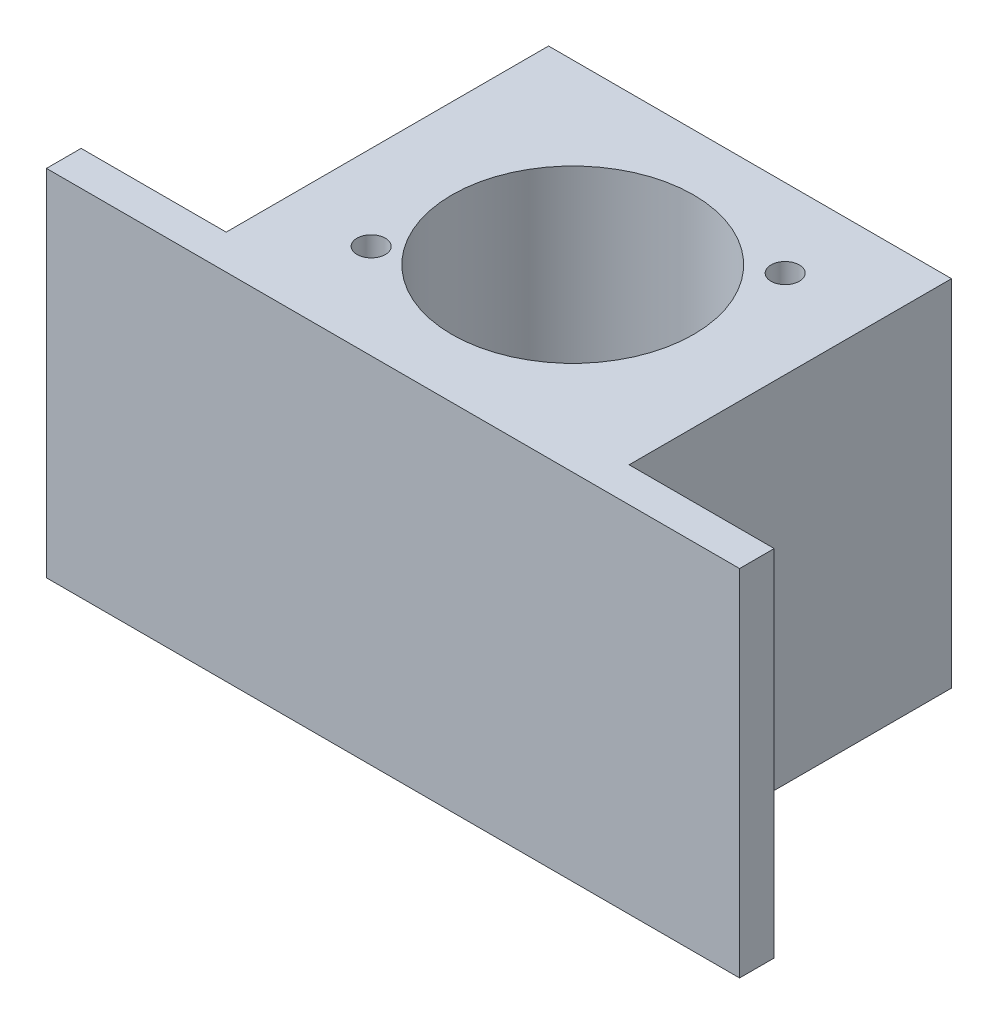
ISO-10303-21;
HEADER;
FILE_DESCRIPTION(('STEP AP214'),'2;1');
FILE_NAME('part.step','',(''),(''),'','','');
FILE_SCHEMA(('AUTOMOTIVE_DESIGN { 1 0 10303 214 1 1 1 1 }'));
ENDSEC;
DATA;
#1=APPLICATION_CONTEXT('core data for automotive mechanical design processes');
#2=APPLICATION_PROTOCOL_DEFINITION('international standard','automotive_design',2000,#1);
#3=PRODUCT_CONTEXT('',#1,'mechanical');
#4=PRODUCT('Part','Part','',(#3));
#5=PRODUCT_RELATED_PRODUCT_CATEGORY('part','',(#4));
#6=PRODUCT_DEFINITION_FORMATION('','',#4);
#7=PRODUCT_DEFINITION_CONTEXT('part definition',#1,'design');
#8=PRODUCT_DEFINITION('design','',#6,#7);
#9=PRODUCT_DEFINITION_SHAPE('','',#8);
#10=(LENGTH_UNIT() NAMED_UNIT(*) SI_UNIT(.MILLI.,.METRE.));
#11=(NAMED_UNIT(*) PLANE_ANGLE_UNIT() SI_UNIT($,.RADIAN.));
#12=(NAMED_UNIT(*) SI_UNIT($,.STERADIAN.) SOLID_ANGLE_UNIT());
#13=UNCERTAINTY_MEASURE_WITH_UNIT(LENGTH_MEASURE(1.E-05),#10,'distance_accuracy_value','');
#14=(GEOMETRIC_REPRESENTATION_CONTEXT(3) GLOBAL_UNCERTAINTY_ASSIGNED_CONTEXT((#13)) GLOBAL_UNIT_ASSIGNED_CONTEXT((#10,
#11,#12)) REPRESENTATION_CONTEXT('',''));
#15=CARTESIAN_POINT('',(0.,0.,0.));
#16=DIRECTION('',(0.,0.,1.));
#17=DIRECTION('',(1.,0.,0.));
#18=AXIS2_PLACEMENT_3D('',#15,#16,#17);
#19=CARTESIAN_POINT('',(0.,0.,-30.));
#20=DIRECTION('',(0.,0.,1.));
#21=DIRECTION('',(1.,0.,0.));
#22=AXIS2_PLACEMENT_3D('',#19,#20,#21);
#23=PLANE('',#22);
#24=DIRECTION('',(0.,-1.,0.));
#25=VECTOR('',#24,1.);
#26=CARTESIAN_POINT('',(-72.5,-25.,-30.));
#27=LINE('',#26,#25);
#28=CARTESIAN_POINT('',(-72.5,-25.,-30.));
#29=VERTEX_POINT('',#28);
#30=CARTESIAN_POINT('',(-72.4999999999999,-45.,-30.));
#31=VERTEX_POINT('',#30);
#32=EDGE_CURVE('E394',#29,#31,#27,.T.);
#33=ORIENTED_EDGE('',*,*,#32,.F.);
#34=CARTESIAN_POINT('',(-77.5,-25.,-30.));
#35=DIRECTION('',(0.,0.,-1.));
#36=DIRECTION('',(-1.,0.,0.));
#37=AXIS2_PLACEMENT_3D('',#34,#35,#36);
#38=CIRCLE('',#37,5.00000000000002);
#39=CARTESIAN_POINT('',(-82.5,-25.,-30.));
#40=VERTEX_POINT('',#39);
#41=EDGE_CURVE('E74',#40,#29,#38,.T.);
#42=ORIENTED_EDGE('',*,*,#41,.F.);
#43=DIRECTION('',(0.,1.,0.));
#44=VECTOR('',#43,1.);
#45=CARTESIAN_POINT('',(-82.5,-25.,-30.));
#46=LINE('',#45,#44);
#47=CARTESIAN_POINT('',(-82.5,-45.,-30.));
#48=VERTEX_POINT('',#47);
#49=EDGE_CURVE('E385',#48,#40,#46,.T.);
#50=ORIENTED_EDGE('',*,*,#49,.F.);
#51=CARTESIAN_POINT('',(-77.5,-45.,-30.));
#52=DIRECTION('',(0.,0.,-1.));
#53=DIRECTION('',(-1.,0.,0.));
#54=AXIS2_PLACEMENT_3D('',#51,#52,#53);
#55=CIRCLE('',#54,5.00000000000002);
#56=EDGE_CURVE('E390',#31,#48,#55,.T.);
#57=ORIENTED_EDGE('',*,*,#56,.F.);
#58=EDGE_LOOP('',(#33,#42,#50,#57));
#59=FACE_BOUND('',#58,.T.);
#60=DIRECTION('',(0.,-1.,0.));
#61=VECTOR('',#60,1.);
#62=CARTESIAN_POINT('',(-72.5,45.,-30.));
#63=LINE('',#62,#61);
#64=CARTESIAN_POINT('',(-72.5,45.,-30.));
#65=VERTEX_POINT('',#64);
#66=CARTESIAN_POINT('',(-72.5,25.,-30.));
#67=VERTEX_POINT('',#66);
#68=EDGE_CURVE('E349',#65,#67,#63,.T.);
#69=ORIENTED_EDGE('',*,*,#68,.F.);
#70=CARTESIAN_POINT('',(-77.5,45.,-30.));
#71=DIRECTION('',(0.,0.,-1.));
#72=DIRECTION('',(-1.,0.,0.));
#73=AXIS2_PLACEMENT_3D('',#70,#71,#72);
#74=CIRCLE('',#73,5.);
#75=CARTESIAN_POINT('',(-82.5,45.,-30.));
#76=VERTEX_POINT('',#75);
#77=EDGE_CURVE('E353',#76,#65,#74,.T.);
#78=ORIENTED_EDGE('',*,*,#77,.F.);
#79=DIRECTION('',(0.,1.,0.));
#80=VECTOR('',#79,1.);
#81=CARTESIAN_POINT('',(-82.5,45.,-30.));
#82=LINE('',#81,#80);
#83=CARTESIAN_POINT('',(-82.5,25.,-30.));
#84=VERTEX_POINT('',#83);
#85=EDGE_CURVE('E340',#84,#76,#82,.T.);
#86=ORIENTED_EDGE('',*,*,#85,.F.);
#87=CARTESIAN_POINT('',(-77.5,25.,-30.));
#88=DIRECTION('',(0.,0.,-1.));
#89=DIRECTION('',(-1.,0.,0.));
#90=AXIS2_PLACEMENT_3D('',#87,#88,#89);
#91=CIRCLE('',#90,5.);
#92=EDGE_CURVE('E345',#67,#84,#91,.T.);
#93=ORIENTED_EDGE('',*,*,#92,.F.);
#94=EDGE_LOOP('',(#69,#78,#86,#93));
#95=FACE_BOUND('',#94,.T.);
#96=DIRECTION('',(0.,1.,0.));
#97=VECTOR('',#96,1.);
#98=CARTESIAN_POINT('',(-62.5,55.,-30.));
#99=LINE('',#98,#97);
#100=CARTESIAN_POINT('',(-62.5,-55.,-30.));
#101=VERTEX_POINT('',#100);
#102=CARTESIAN_POINT('',(-62.5,55.,-30.));
#103=VERTEX_POINT('',#102);
#104=EDGE_CURVE('E287',#101,#103,#99,.T.);
#105=ORIENTED_EDGE('',*,*,#104,.F.);
#106=DIRECTION('',(1.,0.,0.));
#107=VECTOR('',#106,1.);
#108=CARTESIAN_POINT('',(-107.5,-55.,-30.));
#109=LINE('',#108,#107);
#110=CARTESIAN_POINT('',(-107.5,-55.,-30.));
#111=VERTEX_POINT('',#110);
#112=EDGE_CURVE('E249',#111,#101,#109,.T.);
#113=ORIENTED_EDGE('',*,*,#112,.F.);
#114=DIRECTION('',(0.,-1.,0.));
#115=VECTOR('',#114,1.);
#116=CARTESIAN_POINT('',(-107.5,55.,-30.));
#117=LINE('',#116,#115);
#118=CARTESIAN_POINT('',(-107.5,55.,-30.));
#119=VERTEX_POINT('',#118);
#120=EDGE_CURVE('E255',#119,#111,#117,.T.);
#121=ORIENTED_EDGE('',*,*,#120,.F.);
#122=DIRECTION('',(-1.,0.,0.));
#123=VECTOR('',#122,1.);
#124=CARTESIAN_POINT('',(-107.5,55.,-30.));
#125=LINE('',#124,#123);
#126=EDGE_CURVE('E244',#103,#119,#125,.T.);
#127=ORIENTED_EDGE('',*,*,#126,.F.);
#128=EDGE_LOOP('',(#105,#113,#121,#127));
#129=FACE_BOUND('',#128,.T.);
#130=ADVANCED_FACE('F48',(#59,#95,#129),#23,.F.);
#131=DIRECTION('',(0.,-1.,0.));
#132=VECTOR('',#131,1.);
#133=CARTESIAN_POINT('',(77.5,44.999999999999,-30.));
#134=LINE('',#133,#132);
#135=CARTESIAN_POINT('',(77.5,44.999999999999,-30.));
#136=VERTEX_POINT('',#135);
#137=CARTESIAN_POINT('',(77.5,24.999999999999,-30.));
#138=VERTEX_POINT('',#137);
#139=EDGE_CURVE('E437',#136,#138,#134,.T.);
#140=ORIENTED_EDGE('',*,*,#139,.F.);
#141=CARTESIAN_POINT('',(72.5,44.999999999999,-30.));
#142=DIRECTION('',(0.,0.,-1.));
#143=DIRECTION('',(-1.,0.,0.));
#144=AXIS2_PLACEMENT_3D('',#141,#142,#143);
#145=CIRCLE('',#144,4.99999999999996);
#146=CARTESIAN_POINT('',(67.5,44.999999999999,-30.));
#147=VERTEX_POINT('',#146);
#148=EDGE_CURVE('E384',#147,#136,#145,.T.);
#149=ORIENTED_EDGE('',*,*,#148,.F.);
#150=DIRECTION('',(0.,1.,0.));
#151=VECTOR('',#150,1.);
#152=CARTESIAN_POINT('',(67.5,44.999999999999,-30.));
#153=LINE('',#152,#151);
#154=CARTESIAN_POINT('',(67.5,24.999999999999,-30.));
#155=VERTEX_POINT('',#154);
#156=EDGE_CURVE('E428',#155,#147,#153,.T.);
#157=ORIENTED_EDGE('',*,*,#156,.F.);
#158=CARTESIAN_POINT('',(72.5,24.999999999999,-30.));
#159=DIRECTION('',(0.,0.,-1.));
#160=DIRECTION('',(-1.,0.,0.));
#161=AXIS2_PLACEMENT_3D('',#158,#159,#160);
#162=CIRCLE('',#161,4.99999999999998);
#163=EDGE_CURVE('E433',#138,#155,#162,.T.);
#164=ORIENTED_EDGE('',*,*,#163,.F.);
#165=EDGE_LOOP('',(#140,#149,#157,#164));
#166=FACE_BOUND('',#165,.T.);
#167=DIRECTION('',(0.,-1.,0.));
#168=VECTOR('',#167,1.);
#169=CARTESIAN_POINT('',(77.5,-25.,-30.));
#170=LINE('',#169,#168);
#171=CARTESIAN_POINT('',(77.5,-25.,-30.));
#172=VERTEX_POINT('',#171);
#173=CARTESIAN_POINT('',(77.5,-45.,-30.));
#174=VERTEX_POINT('',#173);
#175=EDGE_CURVE('E479',#172,#174,#170,.T.);
#176=ORIENTED_EDGE('',*,*,#175,.F.);
#177=CARTESIAN_POINT('',(72.5,-25.,-30.));
#178=DIRECTION('',(0.,0.,-1.));
#179=DIRECTION('',(-1.,0.,0.));
#180=AXIS2_PLACEMENT_3D('',#177,#178,#179);
#181=CIRCLE('',#180,4.99999999999996);
#182=CARTESIAN_POINT('',(67.5,-25.,-30.));
#183=VERTEX_POINT('',#182);
#184=EDGE_CURVE('E483',#183,#172,#181,.T.);
#185=ORIENTED_EDGE('',*,*,#184,.F.);
#186=DIRECTION('',(0.,1.,0.));
#187=VECTOR('',#186,1.);
#188=CARTESIAN_POINT('',(67.5,-25.,-30.));
#189=LINE('',#188,#187);
#190=CARTESIAN_POINT('',(67.5,-45.,-30.));
#191=VERTEX_POINT('',#190);
#192=EDGE_CURVE('E470',#191,#183,#189,.T.);
#193=ORIENTED_EDGE('',*,*,#192,.F.);
#194=CARTESIAN_POINT('',(72.5,-45.,-30.));
#195=DIRECTION('',(0.,0.,-1.));
#196=DIRECTION('',(-1.,0.,0.));
#197=AXIS2_PLACEMENT_3D('',#194,#195,#196);
#198=CIRCLE('',#197,4.99999999999996);
#199=EDGE_CURVE('E475',#174,#191,#198,.T.);
#200=ORIENTED_EDGE('',*,*,#199,.F.);
#201=EDGE_LOOP('',(#176,#185,#193,#200));
#202=FACE_BOUND('',#201,.T.);
#203=DIRECTION('',(0.,-1.,0.));
#204=VECTOR('',#203,1.);
#205=CARTESIAN_POINT('',(62.5,55.,-30.));
#206=LINE('',#205,#204);
#207=CARTESIAN_POINT('',(62.4999999999999,55.,-30.));
#208=VERTEX_POINT('',#207);
#209=CARTESIAN_POINT('',(62.5,-55.,-30.));
#210=VERTEX_POINT('',#209);
#211=EDGE_CURVE('E282',#208,#210,#206,.T.);
#212=ORIENTED_EDGE('',*,*,#211,.F.);
#213=CARTESIAN_POINT('',(107.5,55.,-30.));
#214=VERTEX_POINT('',#213);
#215=EDGE_CURVE('E258',#214,#208,#125,.T.);
#216=ORIENTED_EDGE('',*,*,#215,.F.);
#217=DIRECTION('',(0.,1.,0.));
#218=VECTOR('',#217,1.);
#219=CARTESIAN_POINT('',(107.5,55.,-30.));
#220=LINE('',#219,#218);
#221=CARTESIAN_POINT('',(107.5,-55.,-30.));
#222=VERTEX_POINT('',#221);
#223=EDGE_CURVE('E262',#222,#214,#220,.T.);
#224=ORIENTED_EDGE('',*,*,#223,.F.);
#225=EDGE_CURVE('E254',#210,#222,#109,.T.);
#226=ORIENTED_EDGE('',*,*,#225,.F.);
#227=EDGE_LOOP('',(#212,#216,#224,#226));
#228=FACE_BOUND('',#227,.T.);
#229=ADVANCED_FACE('F530',(#166,#202,#228),#23,.F.);
#230=CARTESIAN_POINT('',(107.5,55.,-30.));
#231=DIRECTION('',(1.,0.,0.));
#232=DIRECTION('',(0.,1.,0.));
#233=AXIS2_PLACEMENT_3D('',#230,#231,#232);
#234=PLANE('',#233);
#235=DIRECTION('',(0.,-1.,0.));
#236=VECTOR('',#235,1.);
#237=CARTESIAN_POINT('',(107.5,270.860053043633,-19.25));
#238=LINE('',#237,#236);
#239=CARTESIAN_POINT('',(107.5,55.,-19.25));
#240=VERTEX_POINT('',#239);
#241=CARTESIAN_POINT('',(107.5,-55.,-19.25));
#242=VERTEX_POINT('',#241);
#243=EDGE_CURVE('E66',#240,#242,#238,.T.);
#244=ORIENTED_EDGE('',*,*,#243,.T.);
#245=DIRECTION('',(0.,0.,1.));
#246=VECTOR('',#245,1.);
#247=CARTESIAN_POINT('',(107.5,-55.,-30.));
#248=LINE('',#247,#246);
#249=EDGE_CURVE('E11',#222,#242,#248,.T.);
#250=ORIENTED_EDGE('',*,*,#249,.F.);
#251=ORIENTED_EDGE('',*,*,#223,.T.);
#252=DIRECTION('',(0.,0.,1.));
#253=VECTOR('',#252,1.);
#254=CARTESIAN_POINT('',(107.5,55.,-30.));
#255=LINE('',#254,#253);
#256=EDGE_CURVE('E52',#214,#240,#255,.T.);
#257=ORIENTED_EDGE('',*,*,#256,.T.);
#258=EDGE_LOOP('',(#244,#250,#251,#257));
#259=FACE_BOUND('',#258,.T.);
#260=ADVANCED_FACE('F50',(#259),#234,.T.);
#261=CARTESIAN_POINT('',(-107.5,-55.,-30.));
#262=DIRECTION('',(0.,-1.,0.));
#263=DIRECTION('',(0.,0.,-1.));
#264=AXIS2_PLACEMENT_3D('',#261,#262,#263);
#265=PLANE('',#264);
#266=DIRECTION('',(1.,0.,0.));
#267=VECTOR('',#266,1.);
#268=CARTESIAN_POINT('',(-107.5,-55.,-19.25));
#269=LINE('',#268,#267);
#270=CARTESIAN_POINT('',(-107.5,-55.,-19.25));
#271=VERTEX_POINT('',#270);
#272=EDGE_CURVE('E239',#271,#242,#269,.T.);
#273=ORIENTED_EDGE('',*,*,#272,.F.);
#274=DIRECTION('',(0.,0.,1.));
#275=VECTOR('',#274,1.);
#276=CARTESIAN_POINT('',(-107.5,-55.,-30.));
#277=LINE('',#276,#275);
#278=EDGE_CURVE('E58',#111,#271,#277,.T.);
#279=ORIENTED_EDGE('',*,*,#278,.F.);
#280=ORIENTED_EDGE('',*,*,#112,.T.);
#281=DIRECTION('',(0.,0.,1.));
#282=VECTOR('',#281,1.);
#283=CARTESIAN_POINT('',(-62.5,-55.,-130.));
#284=LINE('',#283,#282);
#285=CARTESIAN_POINT('',(-62.5,-55.,-130.));
#286=VERTEX_POINT('',#285);
#287=EDGE_CURVE('E277',#286,#101,#284,.T.);
#288=ORIENTED_EDGE('',*,*,#287,.F.);
#289=DIRECTION('',(-1.,0.,0.));
#290=VECTOR('',#289,1.);
#291=CARTESIAN_POINT('',(62.5,-55.,-130.));
#292=LINE('',#291,#290);
#293=CARTESIAN_POINT('',(62.5,-55.,-130.));
#294=VERTEX_POINT('',#293);
#295=EDGE_CURVE('E281',#294,#286,#292,.T.);
#296=ORIENTED_EDGE('',*,*,#295,.F.);
#297=DIRECTION('',(0.,0.,1.));
#298=VECTOR('',#297,1.);
#299=CARTESIAN_POINT('',(62.5,-55.,-130.));
#300=LINE('',#299,#298);
#301=EDGE_CURVE('E273',#294,#210,#300,.T.);
#302=ORIENTED_EDGE('',*,*,#301,.T.);
#303=ORIENTED_EDGE('',*,*,#225,.T.);
#304=ORIENTED_EDGE('',*,*,#249,.T.);
#305=EDGE_LOOP('',(#273,#279,#280,#288,#296,#302,#303,#304));
#306=FACE_BOUND('',#305,.T.);
#307=CARTESIAN_POINT('',(34.6882295483987,-55.,-40.3746294951222));
#308=DIRECTION('',(0.,-1.,0.));
#309=DIRECTION('',(0.,0.,-1.));
#310=AXIS2_PLACEMENT_3D('',#307,#308,#309);
#311=CIRCLE('',#310,4.39999999999999);
#312=CARTESIAN_POINT('',(34.6882295483987,-55.,-44.7746294951222));
#313=VERTEX_POINT('',#312);
#314=EDGE_CURVE('E512',#313,#313,#311,.T.);
#315=ORIENTED_EDGE('',*,*,#314,.F.);
#316=EDGE_LOOP('',(#315));
#317=FACE_BOUND('',#316,.T.);
#318=CARTESIAN_POINT('',(-34.4238415782311,-55.,-110.40558348906));
#319=DIRECTION('',(0.,-1.,0.));
#320=DIRECTION('',(0.,0.,-1.));
#321=AXIS2_PLACEMENT_3D('',#318,#319,#320);
#322=CIRCLE('',#321,4.39999999999999);
#323=CARTESIAN_POINT('',(-34.4238415782311,-55.,-114.80558348906));
#324=VERTEX_POINT('',#323);
#325=EDGE_CURVE('E504',#324,#324,#322,.T.);
#326=ORIENTED_EDGE('',*,*,#325,.F.);
#327=EDGE_LOOP('',(#326));
#328=FACE_BOUND('',#327,.T.);
#329=CARTESIAN_POINT('',(0.,-55.,-75.));
#330=DIRECTION('',(0.,1.,0.));
#331=DIRECTION('',(0.,0.,1.));
#332=AXIS2_PLACEMENT_3D('',#329,#330,#331);
#333=CIRCLE('',#332,37.5);
#334=CARTESIAN_POINT('',(0.,-55.,-37.5));
#335=VERTEX_POINT('',#334);
#336=EDGE_CURVE('E291',#335,#335,#333,.T.);
#337=ORIENTED_EDGE('',*,*,#336,.T.);
#338=EDGE_LOOP('',(#337));
#339=FACE_BOUND('',#338,.T.);
#340=ADVANCED_FACE('F523',(#306,#317,#328,#339),#265,.T.);
#341=CARTESIAN_POINT('',(-107.5,55.,-30.));
#342=DIRECTION('',(-1.,0.,0.));
#343=DIRECTION('',(0.,-1.,0.));
#344=AXIS2_PLACEMENT_3D('',#341,#342,#343);
#345=PLANE('',#344);
#346=DIRECTION('',(0.,-1.,0.));
#347=VECTOR('',#346,1.);
#348=CARTESIAN_POINT('',(-107.5,270.860053043633,-19.25));
#349=LINE('',#348,#347);
#350=CARTESIAN_POINT('',(-107.5,55.,-19.25));
#351=VERTEX_POINT('',#350);
#352=EDGE_CURVE('E224',#351,#271,#349,.T.);
#353=ORIENTED_EDGE('',*,*,#352,.F.);
#354=DIRECTION('',(0.,0.,1.));
#355=VECTOR('',#354,1.);
#356=CARTESIAN_POINT('',(-107.5,55.,-30.));
#357=LINE('',#356,#355);
#358=EDGE_CURVE('E236',#119,#351,#357,.T.);
#359=ORIENTED_EDGE('',*,*,#358,.F.);
#360=ORIENTED_EDGE('',*,*,#120,.T.);
#361=ORIENTED_EDGE('',*,*,#278,.T.);
#362=EDGE_LOOP('',(#353,#359,#360,#361));
#363=FACE_BOUND('',#362,.T.);
#364=ADVANCED_FACE('F234',(#363),#345,.T.);
#365=CARTESIAN_POINT('',(-107.5,55.,-30.));
#366=DIRECTION('',(0.,1.,0.));
#367=DIRECTION('',(0.,0.,1.));
#368=AXIS2_PLACEMENT_3D('',#365,#366,#367);
#369=PLANE('',#368);
#370=DIRECTION('',(1.,0.,0.));
#371=VECTOR('',#370,1.);
#372=CARTESIAN_POINT('',(-107.5,55.,-19.25));
#373=LINE('',#372,#371);
#374=EDGE_CURVE('E221',#351,#240,#373,.T.);
#375=ORIENTED_EDGE('',*,*,#374,.T.);
#376=ORIENTED_EDGE('',*,*,#256,.F.);
#377=ORIENTED_EDGE('',*,*,#215,.T.);
#378=DIRECTION('',(0.,0.,1.));
#379=VECTOR('',#378,1.);
#380=CARTESIAN_POINT('',(62.5,55.,-130.));
#381=LINE('',#380,#379);
#382=CARTESIAN_POINT('',(62.5,55.,-130.));
#383=VERTEX_POINT('',#382);
#384=EDGE_CURVE('E269',#383,#208,#381,.T.);
#385=ORIENTED_EDGE('',*,*,#384,.F.);
#386=DIRECTION('',(1.,0.,0.));
#387=VECTOR('',#386,1.);
#388=CARTESIAN_POINT('',(62.5,55.,-130.));
#389=LINE('',#388,#387);
#390=CARTESIAN_POINT('',(-62.5,55.,-130.));
#391=VERTEX_POINT('',#390);
#392=EDGE_CURVE('E297',#391,#383,#389,.T.);
#393=ORIENTED_EDGE('',*,*,#392,.F.);
#394=DIRECTION('',(0.,0.,1.));
#395=VECTOR('',#394,1.);
#396=CARTESIAN_POINT('',(-62.5,55.,-130.));
#397=LINE('',#396,#395);
#398=EDGE_CURVE('E266',#391,#103,#397,.T.);
#399=ORIENTED_EDGE('',*,*,#398,.T.);
#400=ORIENTED_EDGE('',*,*,#126,.T.);
#401=ORIENTED_EDGE('',*,*,#358,.T.);
#402=EDGE_LOOP('',(#375,#376,#377,#385,#393,#399,#400,#401));
#403=FACE_BOUND('',#402,.T.);
#404=CARTESIAN_POINT('',(-36.193891144319,55.,-48.66802116773));
#405=DIRECTION('',(0.,1.,0.));
#406=DIRECTION('',(0.,0.,1.));
#407=AXIS2_PLACEMENT_3D('',#404,#405,#406);
#408=CIRCLE('',#407,4.39999999999999);
#409=CARTESIAN_POINT('',(-36.193891144319,55.,-44.26802116773));
#410=VERTEX_POINT('',#409);
#411=EDGE_CURVE('E322',#410,#410,#408,.T.);
#412=ORIENTED_EDGE('',*,*,#411,.F.);
#413=EDGE_LOOP('',(#412));
#414=FACE_BOUND('',#413,.T.);
#415=CARTESIAN_POINT('',(35.2010191727053,55.,-105.694239325416));
#416=DIRECTION('',(0.,1.,0.));
#417=DIRECTION('',(0.,0.,1.));
#418=AXIS2_PLACEMENT_3D('',#415,#416,#417);
#419=CIRCLE('',#418,4.39999999999999);
#420=CARTESIAN_POINT('',(35.2010191727053,55.,-101.294239325416));
#421=VERTEX_POINT('',#420);
#422=EDGE_CURVE('E314',#421,#421,#419,.T.);
#423=ORIENTED_EDGE('',*,*,#422,.F.);
#424=EDGE_LOOP('',(#423));
#425=FACE_BOUND('',#424,.T.);
#426=CARTESIAN_POINT('',(0.,55.,-75.));
#427=DIRECTION('',(0.,1.,0.));
#428=DIRECTION('',(0.,0.,1.));
#429=AXIS2_PLACEMENT_3D('',#426,#427,#428);
#430=CIRCLE('',#429,37.5);
#431=CARTESIAN_POINT('',(0.,55.,-37.5));
#432=VERTEX_POINT('',#431);
#433=EDGE_CURVE('E303',#432,#432,#430,.T.);
#434=ORIENTED_EDGE('',*,*,#433,.F.);
#435=EDGE_LOOP('',(#434));
#436=FACE_BOUND('',#435,.T.);
#437=ADVANCED_FACE('F241',(#403,#414,#425,#436),#369,.T.);
#438=CARTESIAN_POINT('',(-62.5,55.,-130.));
#439=DIRECTION('',(1.,0.,0.));
#440=DIRECTION('',(0.,1.,0.));
#441=AXIS2_PLACEMENT_3D('',#438,#439,#440);
#442=PLANE('',#441);
#443=ORIENTED_EDGE('',*,*,#104,.T.);
#444=ORIENTED_EDGE('',*,*,#398,.F.);
#445=DIRECTION('',(0.,1.,0.));
#446=VECTOR('',#445,1.);
#447=CARTESIAN_POINT('',(-62.5,55.,-130.));
#448=LINE('',#447,#446);
#449=EDGE_CURVE('E286',#286,#391,#448,.T.);
#450=ORIENTED_EDGE('',*,*,#449,.F.);
#451=ORIENTED_EDGE('',*,*,#287,.T.);
#452=EDGE_LOOP('',(#443,#444,#450,#451));
#453=FACE_BOUND('',#452,.T.);
#454=ADVANCED_FACE('F542',(#453),#442,.F.);
#455=CARTESIAN_POINT('',(62.5,55.,-130.));
#456=DIRECTION('',(-1.,0.,0.));
#457=DIRECTION('',(0.,-1.,0.));
#458=AXIS2_PLACEMENT_3D('',#455,#456,#457);
#459=PLANE('',#458);
#460=ORIENTED_EDGE('',*,*,#211,.T.);
#461=ORIENTED_EDGE('',*,*,#301,.F.);
#462=DIRECTION('',(0.,-1.,0.));
#463=VECTOR('',#462,1.);
#464=CARTESIAN_POINT('',(62.5,55.,-130.));
#465=LINE('',#464,#463);
#466=EDGE_CURVE('E294',#383,#294,#465,.T.);
#467=ORIENTED_EDGE('',*,*,#466,.F.);
#468=ORIENTED_EDGE('',*,*,#384,.T.);
#469=EDGE_LOOP('',(#460,#461,#467,#468));
#470=FACE_BOUND('',#469,.T.);
#471=ADVANCED_FACE('F533',(#470),#459,.F.);
#472=CARTESIAN_POINT('',(0.,0.,-130.));
#473=DIRECTION('',(0.,0.,-1.));
#474=DIRECTION('',(-1.,0.,0.));
#475=AXIS2_PLACEMENT_3D('',#472,#473,#474);
#476=PLANE('',#475);
#477=ORIENTED_EDGE('',*,*,#449,.T.);
#478=ORIENTED_EDGE('',*,*,#392,.T.);
#479=ORIENTED_EDGE('',*,*,#466,.T.);
#480=ORIENTED_EDGE('',*,*,#295,.T.);
#481=EDGE_LOOP('',(#477,#478,#479,#480));
#482=FACE_BOUND('',#481,.T.);
#483=ADVANCED_FACE('F539',(#482),#476,.T.);
#484=CARTESIAN_POINT('',(0.,-55.,-75.));
#485=DIRECTION('',(0.,1.,0.));
#486=DIRECTION('',(0.,0.,1.));
#487=AXIS2_PLACEMENT_3D('',#484,#485,#486);
#488=CYLINDRICAL_SURFACE('',#487,37.5);
#489=ORIENTED_EDGE('',*,*,#336,.F.);
#490=EDGE_LOOP('',(#489));
#491=FACE_BOUND('',#490,.T.);
#492=ORIENTED_EDGE('',*,*,#433,.T.);
#493=EDGE_LOOP('',(#492));
#494=FACE_BOUND('',#493,.T.);
#495=ADVANCED_FACE('F571',(#491,#494),#488,.F.);
#496=CARTESIAN_POINT('',(35.2010191727053,21.6437867237213,-105.694239325416));
#497=DIRECTION('',(0.,1.,0.));
#498=DIRECTION('',(0.,0.,1.));
#499=AXIS2_PLACEMENT_3D('',#496,#497,#498);
#500=CONICAL_SURFACE('',#499,4.39999999999999,1.02974425867665);
#501=CARTESIAN_POINT('',(35.2010191727053,19.,-105.694239325416));
#502=VERTEX_POINT('',#501);
#503=VERTEX_LOOP('',#502);
#504=FACE_BOUND('',#503,.T.);
#505=CARTESIAN_POINT('',(35.2010191727053,21.6437867237213,-105.694239325416));
#506=DIRECTION('',(0.,1.,0.));
#507=DIRECTION('',(0.,0.,1.));
#508=AXIS2_PLACEMENT_3D('',#505,#506,#507);
#509=CIRCLE('',#508,4.39999999999999);
#510=CARTESIAN_POINT('',(35.2010191727053,21.6437867237213,-101.294239325416));
#511=VERTEX_POINT('',#510);
#512=EDGE_CURVE('E307',#511,#511,#509,.T.);
#513=ORIENTED_EDGE('',*,*,#512,.T.);
#514=EDGE_LOOP('',(#513));
#515=FACE_BOUND('',#514,.T.);
#516=ADVANCED_FACE('F576',(#504,#515),#500,.F.);
#517=CARTESIAN_POINT('',(35.2010191727053,55.,-105.694239325416));
#518=DIRECTION('',(0.,1.,0.));
#519=DIRECTION('',(0.,0.,1.));
#520=AXIS2_PLACEMENT_3D('',#517,#518,#519);
#521=CYLINDRICAL_SURFACE('',#520,4.39999999999999);
#522=ORIENTED_EDGE('',*,*,#512,.F.);
#523=EDGE_LOOP('',(#522));
#524=FACE_BOUND('',#523,.T.);
#525=ORIENTED_EDGE('',*,*,#422,.T.);
#526=EDGE_LOOP('',(#525));
#527=FACE_BOUND('',#526,.T.);
#528=ADVANCED_FACE('F580',(#524,#527),#521,.F.);
#529=CARTESIAN_POINT('',(-36.193891144319,21.6437867237213,-48.66802116773));
#530=DIRECTION('',(0.,1.,0.));
#531=DIRECTION('',(0.,0.,1.));
#532=AXIS2_PLACEMENT_3D('',#529,#530,#531);
#533=CONICAL_SURFACE('',#532,4.39999999999999,1.02974425867665);
#534=CARTESIAN_POINT('',(-36.193891144319,19.,-48.66802116773));
#535=VERTEX_POINT('',#534);
#536=VERTEX_LOOP('',#535);
#537=FACE_BOUND('',#536,.T.);
#538=CARTESIAN_POINT('',(-36.193891144319,21.6437867237213,-48.66802116773));
#539=DIRECTION('',(0.,1.,0.));
#540=DIRECTION('',(0.,0.,1.));
#541=AXIS2_PLACEMENT_3D('',#538,#539,#540);
#542=CIRCLE('',#541,4.39999999999999);
#543=CARTESIAN_POINT('',(-36.193891144319,21.6437867237213,-44.26802116773));
#544=VERTEX_POINT('',#543);
#545=EDGE_CURVE('E318',#544,#544,#542,.T.);
#546=ORIENTED_EDGE('',*,*,#545,.T.);
#547=EDGE_LOOP('',(#546));
#548=FACE_BOUND('',#547,.T.);
#549=ADVANCED_FACE('F584',(#537,#548),#533,.F.);
#550=CARTESIAN_POINT('',(-36.193891144319,55.,-48.66802116773));
#551=DIRECTION('',(0.,1.,0.));
#552=DIRECTION('',(0.,0.,1.));
#553=AXIS2_PLACEMENT_3D('',#550,#551,#552);
#554=CYLINDRICAL_SURFACE('',#553,4.39999999999999);
#555=ORIENTED_EDGE('',*,*,#545,.F.);
#556=EDGE_LOOP('',(#555));
#557=FACE_BOUND('',#556,.T.);
#558=ORIENTED_EDGE('',*,*,#411,.T.);
#559=EDGE_LOOP('',(#558));
#560=FACE_BOUND('',#559,.T.);
#561=ADVANCED_FACE('F588',(#557,#560),#554,.F.);
#562=CARTESIAN_POINT('',(72.5,-25.,-20.));
#563=DIRECTION('',(0.,0.,-1.));
#564=DIRECTION('',(-1.,0.,0.));
#565=AXIS2_PLACEMENT_3D('',#562,#563,#564);
#566=CYLINDRICAL_SURFACE('',#565,4.99999999999996);
#567=ORIENTED_EDGE('',*,*,#184,.T.);
#568=DIRECTION('',(0.,0.,-1.));
#569=VECTOR('',#568,1.);
#570=CARTESIAN_POINT('',(77.5,-25.,-20.));
#571=LINE('',#570,#569);
#572=CARTESIAN_POINT('',(77.5,-25.,-20.));
#573=VERTEX_POINT('',#572);
#574=EDGE_CURVE('E457',#573,#172,#571,.T.);
#575=ORIENTED_EDGE('',*,*,#574,.F.);
#576=CARTESIAN_POINT('',(72.5,-25.,-20.));
#577=DIRECTION('',(0.,0.,-1.));
#578=DIRECTION('',(-1.,0.,0.));
#579=AXIS2_PLACEMENT_3D('',#576,#577,#578);
#580=CIRCLE('',#579,4.99999999999996);
#581=CARTESIAN_POINT('',(67.5,-25.,-20.));
#582=VERTEX_POINT('',#581);
#583=EDGE_CURVE('E474',#582,#573,#580,.T.);
#584=ORIENTED_EDGE('',*,*,#583,.F.);
#585=DIRECTION('',(0.,0.,-1.));
#586=VECTOR('',#585,1.);
#587=CARTESIAN_POINT('',(67.5,-25.,-20.));
#588=LINE('',#587,#586);
#589=EDGE_CURVE('E400',#582,#183,#588,.T.);
#590=ORIENTED_EDGE('',*,*,#589,.T.);
#591=EDGE_LOOP('',(#567,#575,#584,#590));
#592=FACE_BOUND('',#591,.T.);
#593=ADVANCED_FACE('F592',(#592),#566,.F.);
#594=CARTESIAN_POINT('',(67.5,-25.,-20.));
#595=DIRECTION('',(-1.,0.,0.));
#596=DIRECTION('',(0.,0.,1.));
#597=AXIS2_PLACEMENT_3D('',#594,#595,#596);
#598=PLANE('',#597);
#599=ORIENTED_EDGE('',*,*,#192,.T.);
#600=ORIENTED_EDGE('',*,*,#589,.F.);
#601=DIRECTION('',(0.,1.,0.));
#602=VECTOR('',#601,1.);
#603=CARTESIAN_POINT('',(67.5,-25.,-20.));
#604=LINE('',#603,#602);
#605=CARTESIAN_POINT('',(67.5,-45.,-20.));
#606=VERTEX_POINT('',#605);
#607=EDGE_CURVE('E462',#606,#582,#604,.T.);
#608=ORIENTED_EDGE('',*,*,#607,.F.);
#609=DIRECTION('',(0.,0.,-1.));
#610=VECTOR('',#609,1.);
#611=CARTESIAN_POINT('',(67.5,-45.,-20.));
#612=LINE('',#611,#610);
#613=EDGE_CURVE('E465',#606,#191,#612,.T.);
#614=ORIENTED_EDGE('',*,*,#613,.T.);
#615=EDGE_LOOP('',(#599,#600,#608,#614));
#616=FACE_BOUND('',#615,.T.);
#617=ADVANCED_FACE('F657',(#616),#598,.F.);
#618=CARTESIAN_POINT('',(72.5,-45.,-20.));
#619=DIRECTION('',(0.,0.,-1.));
#620=DIRECTION('',(-1.,0.,0.));
#621=AXIS2_PLACEMENT_3D('',#618,#619,#620);
#622=CYLINDRICAL_SURFACE('',#621,4.99999999999996);
#623=ORIENTED_EDGE('',*,*,#199,.T.);
#624=ORIENTED_EDGE('',*,*,#613,.F.);
#625=CARTESIAN_POINT('',(72.5,-45.,-20.));
#626=DIRECTION('',(0.,0.,-1.));
#627=DIRECTION('',(-1.,0.,0.));
#628=AXIS2_PLACEMENT_3D('',#625,#626,#627);
#629=CIRCLE('',#628,4.99999999999996);
#630=CARTESIAN_POINT('',(77.5,-45.,-20.));
#631=VERTEX_POINT('',#630);
#632=EDGE_CURVE('E490',#631,#606,#629,.T.);
#633=ORIENTED_EDGE('',*,*,#632,.F.);
#634=DIRECTION('',(0.,0.,-1.));
#635=VECTOR('',#634,1.);
#636=CARTESIAN_POINT('',(77.5,-45.,-20.));
#637=LINE('',#636,#635);
#638=EDGE_CURVE('E461',#631,#174,#637,.T.);
#639=ORIENTED_EDGE('',*,*,#638,.T.);
#640=EDGE_LOOP('',(#623,#624,#633,#639));
#641=FACE_BOUND('',#640,.T.);
#642=ADVANCED_FACE('F662',(#641),#622,.F.);
#643=CARTESIAN_POINT('',(77.5,-25.,-20.));
#644=DIRECTION('',(1.,0.,0.));
#645=DIRECTION('',(0.,0.,-1.));
#646=AXIS2_PLACEMENT_3D('',#643,#644,#645);
#647=PLANE('',#646);
#648=ORIENTED_EDGE('',*,*,#175,.T.);
#649=ORIENTED_EDGE('',*,*,#638,.F.);
#650=DIRECTION('',(0.,-1.,0.));
#651=VECTOR('',#650,1.);
#652=CARTESIAN_POINT('',(77.5,-25.,-20.));
#653=LINE('',#652,#651);
#654=EDGE_CURVE('E494',#573,#631,#653,.T.);
#655=ORIENTED_EDGE('',*,*,#654,.F.);
#656=ORIENTED_EDGE('',*,*,#574,.T.);
#657=EDGE_LOOP('',(#648,#649,#655,#656));
#658=FACE_BOUND('',#657,.T.);
#659=ADVANCED_FACE('F659',(#658),#647,.F.);
#660=CARTESIAN_POINT('',(72.5,-25.,-20.));
#661=DIRECTION('',(0.,0.,-1.));
#662=DIRECTION('',(-1.,0.,0.));
#663=AXIS2_PLACEMENT_3D('',#660,#661,#662);
#664=PLANE('',#663);
#665=ORIENTED_EDGE('',*,*,#583,.T.);
#666=ORIENTED_EDGE('',*,*,#654,.T.);
#667=ORIENTED_EDGE('',*,*,#632,.T.);
#668=ORIENTED_EDGE('',*,*,#607,.T.);
#669=EDGE_LOOP('',(#665,#666,#667,#668));
#670=FACE_BOUND('',#669,.T.);
#671=ADVANCED_FACE('F639',(#670),#664,.T.);
#672=CARTESIAN_POINT('',(72.5,44.999999999999,-20.));
#673=DIRECTION('',(0.,0.,-1.));
#674=DIRECTION('',(-1.,0.,0.));
#675=AXIS2_PLACEMENT_3D('',#672,#673,#674);
#676=CYLINDRICAL_SURFACE('',#675,4.99999999999996);
#677=ORIENTED_EDGE('',*,*,#148,.T.);
#678=DIRECTION('',(0.,0.,-1.));
#679=VECTOR('',#678,1.);
#680=CARTESIAN_POINT('',(77.5,44.999999999999,-20.));
#681=LINE('',#680,#679);
#682=CARTESIAN_POINT('',(77.5,44.999999999999,-20.));
#683=VERTEX_POINT('',#682);
#684=EDGE_CURVE('E415',#683,#136,#681,.T.);
#685=ORIENTED_EDGE('',*,*,#684,.F.);
#686=CARTESIAN_POINT('',(72.5,44.999999999999,-20.));
#687=DIRECTION('',(0.,0.,-1.));
#688=DIRECTION('',(-1.,0.,0.));
#689=AXIS2_PLACEMENT_3D('',#686,#687,#688);
#690=CIRCLE('',#689,4.99999999999996);
#691=CARTESIAN_POINT('',(67.5,44.999999999999,-20.));
#692=VERTEX_POINT('',#691);
#693=EDGE_CURVE('E432',#692,#683,#690,.T.);
#694=ORIENTED_EDGE('',*,*,#693,.F.);
#695=DIRECTION('',(0.,0.,-1.));
#696=VECTOR('',#695,1.);
#697=CARTESIAN_POINT('',(67.5,44.999999999999,-20.));
#698=LINE('',#697,#696);
#699=EDGE_CURVE('E356',#692,#147,#698,.T.);
#700=ORIENTED_EDGE('',*,*,#699,.T.);
#701=EDGE_LOOP('',(#677,#685,#694,#700));
#702=FACE_BOUND('',#701,.T.);
#703=ADVANCED_FACE('F635',(#702),#676,.F.);
#704=CARTESIAN_POINT('',(67.5,44.999999999999,-20.));
#705=DIRECTION('',(-1.,0.,0.));
#706=DIRECTION('',(0.,-1.,0.));
#707=AXIS2_PLACEMENT_3D('',#704,#705,#706);
#708=PLANE('',#707);
#709=ORIENTED_EDGE('',*,*,#156,.T.);
#710=ORIENTED_EDGE('',*,*,#699,.F.);
#711=DIRECTION('',(0.,1.,0.));
#712=VECTOR('',#711,1.);
#713=CARTESIAN_POINT('',(67.5,44.999999999999,-20.));
#714=LINE('',#713,#712);
#715=CARTESIAN_POINT('',(67.5,24.999999999999,-20.));
#716=VERTEX_POINT('',#715);
#717=EDGE_CURVE('E420',#716,#692,#714,.T.);
#718=ORIENTED_EDGE('',*,*,#717,.F.);
#719=DIRECTION('',(0.,0.,-1.));
#720=VECTOR('',#719,1.);
#721=CARTESIAN_POINT('',(67.5,24.999999999999,-20.));
#722=LINE('',#721,#720);
#723=EDGE_CURVE('E423',#716,#155,#722,.T.);
#724=ORIENTED_EDGE('',*,*,#723,.T.);
#725=EDGE_LOOP('',(#709,#710,#718,#724));
#726=FACE_BOUND('',#725,.T.);
#727=ADVANCED_FACE('F638',(#726),#708,.F.);
#728=CARTESIAN_POINT('',(72.5,24.999999999999,-20.));
#729=DIRECTION('',(0.,0.,-1.));
#730=DIRECTION('',(-1.,0.,0.));
#731=AXIS2_PLACEMENT_3D('',#728,#729,#730);
#732=CYLINDRICAL_SURFACE('',#731,4.99999999999998);
#733=ORIENTED_EDGE('',*,*,#163,.T.);
#734=ORIENTED_EDGE('',*,*,#723,.F.);
#735=CARTESIAN_POINT('',(72.5,24.999999999999,-20.));
#736=DIRECTION('',(0.,0.,-1.));
#737=DIRECTION('',(-1.,0.,0.));
#738=AXIS2_PLACEMENT_3D('',#735,#736,#737);
#739=CIRCLE('',#738,4.99999999999998);
#740=CARTESIAN_POINT('',(77.5,24.999999999999,-20.));
#741=VERTEX_POINT('',#740);
#742=EDGE_CURVE('E446',#741,#716,#739,.T.);
#743=ORIENTED_EDGE('',*,*,#742,.F.);
#744=DIRECTION('',(0.,0.,-1.));
#745=VECTOR('',#744,1.);
#746=CARTESIAN_POINT('',(77.5,24.999999999999,-20.));
#747=LINE('',#746,#745);
#748=EDGE_CURVE('E419',#741,#138,#747,.T.);
#749=ORIENTED_EDGE('',*,*,#748,.T.);
#750=EDGE_LOOP('',(#733,#734,#743,#749));
#751=FACE_BOUND('',#750,.T.);
#752=ADVANCED_FACE('F644',(#751),#732,.F.);
#753=CARTESIAN_POINT('',(77.5,44.999999999999,-20.));
#754=DIRECTION('',(1.,0.,0.));
#755=DIRECTION('',(0.,1.,0.));
#756=AXIS2_PLACEMENT_3D('',#753,#754,#755);
#757=PLANE('',#756);
#758=ORIENTED_EDGE('',*,*,#139,.T.);
#759=ORIENTED_EDGE('',*,*,#748,.F.);
#760=DIRECTION('',(0.,-1.,0.));
#761=VECTOR('',#760,1.);
#762=CARTESIAN_POINT('',(77.5,44.999999999999,-20.));
#763=LINE('',#762,#761);
#764=EDGE_CURVE('E450',#683,#741,#763,.T.);
#765=ORIENTED_EDGE('',*,*,#764,.F.);
#766=ORIENTED_EDGE('',*,*,#684,.T.);
#767=EDGE_LOOP('',(#758,#759,#765,#766));
#768=FACE_BOUND('',#767,.T.);
#769=ADVANCED_FACE('F641',(#768),#757,.F.);
#770=CARTESIAN_POINT('',(72.5,44.999999999999,-20.));
#771=DIRECTION('',(0.,0.,-1.));
#772=DIRECTION('',(-1.,0.,0.));
#773=AXIS2_PLACEMENT_3D('',#770,#771,#772);
#774=PLANE('',#773);
#775=ORIENTED_EDGE('',*,*,#693,.T.);
#776=ORIENTED_EDGE('',*,*,#764,.T.);
#777=ORIENTED_EDGE('',*,*,#742,.T.);
#778=ORIENTED_EDGE('',*,*,#717,.T.);
#779=EDGE_LOOP('',(#775,#776,#777,#778));
#780=FACE_BOUND('',#779,.T.);
#781=ADVANCED_FACE('F598',(#780),#774,.T.);
#782=CARTESIAN_POINT('',(-77.5,45.,-20.));
#783=DIRECTION('',(0.,0.,-1.));
#784=DIRECTION('',(-1.,0.,0.));
#785=AXIS2_PLACEMENT_3D('',#782,#783,#784);
#786=CYLINDRICAL_SURFACE('',#785,5.);
#787=ORIENTED_EDGE('',*,*,#77,.T.);
#788=DIRECTION('',(0.,0.,-1.));
#789=VECTOR('',#788,1.);
#790=CARTESIAN_POINT('',(-72.5,45.,-20.));
#791=LINE('',#790,#789);
#792=CARTESIAN_POINT('',(-72.5,45.,-20.));
#793=VERTEX_POINT('',#792);
#794=EDGE_CURVE('E327',#793,#65,#791,.T.);
#795=ORIENTED_EDGE('',*,*,#794,.F.);
#796=CARTESIAN_POINT('',(-77.5,45.,-20.));
#797=DIRECTION('',(0.,0.,-1.));
#798=DIRECTION('',(-1.,0.,0.));
#799=AXIS2_PLACEMENT_3D('',#796,#797,#798);
#800=CIRCLE('',#799,5.);
#801=CARTESIAN_POINT('',(-82.5,45.,-20.));
#802=VERTEX_POINT('',#801);
#803=EDGE_CURVE('E344',#802,#793,#800,.T.);
#804=ORIENTED_EDGE('',*,*,#803,.F.);
#805=DIRECTION('',(0.,0.,-1.));
#806=VECTOR('',#805,1.);
#807=CARTESIAN_POINT('',(-82.5,45.,-20.));
#808=LINE('',#807,#806);
#809=EDGE_CURVE('E326',#802,#76,#808,.T.);
#810=ORIENTED_EDGE('',*,*,#809,.T.);
#811=EDGE_LOOP('',(#787,#795,#804,#810));
#812=FACE_BOUND('',#811,.T.);
#813=ADVANCED_FACE('F594',(#812),#786,.F.);
#814=CARTESIAN_POINT('',(-82.5,45.,-20.));
#815=DIRECTION('',(-1.,0.,0.));
#816=DIRECTION('',(0.,-1.,0.));
#817=AXIS2_PLACEMENT_3D('',#814,#815,#816);
#818=PLANE('',#817);
#819=ORIENTED_EDGE('',*,*,#85,.T.);
#820=ORIENTED_EDGE('',*,*,#809,.F.);
#821=DIRECTION('',(0.,1.,0.));
#822=VECTOR('',#821,1.);
#823=CARTESIAN_POINT('',(-82.5,45.,-20.));
#824=LINE('',#823,#822);
#825=CARTESIAN_POINT('',(-82.5,25.,-20.));
#826=VERTEX_POINT('',#825);
#827=EDGE_CURVE('E332',#826,#802,#824,.T.);
#828=ORIENTED_EDGE('',*,*,#827,.F.);
#829=DIRECTION('',(0.,0.,-1.));
#830=VECTOR('',#829,1.);
#831=CARTESIAN_POINT('',(-82.5,25.,-20.));
#832=LINE('',#831,#830);
#833=EDGE_CURVE('E335',#826,#84,#832,.T.);
#834=ORIENTED_EDGE('',*,*,#833,.T.);
#835=EDGE_LOOP('',(#819,#820,#828,#834));
#836=FACE_BOUND('',#835,.T.);
#837=ADVANCED_FACE('F597',(#836),#818,.F.);
#838=CARTESIAN_POINT('',(-77.5,25.,-20.));
#839=DIRECTION('',(0.,0.,-1.));
#840=DIRECTION('',(-1.,0.,0.));
#841=AXIS2_PLACEMENT_3D('',#838,#839,#840);
#842=CYLINDRICAL_SURFACE('',#841,5.);
#843=ORIENTED_EDGE('',*,*,#92,.T.);
#844=ORIENTED_EDGE('',*,*,#833,.F.);
#845=CARTESIAN_POINT('',(-77.5,25.,-20.));
#846=DIRECTION('',(0.,0.,-1.));
#847=DIRECTION('',(-1.,0.,0.));
#848=AXIS2_PLACEMENT_3D('',#845,#846,#847);
#849=CIRCLE('',#848,5.);
#850=CARTESIAN_POINT('',(-72.5,25.,-20.));
#851=VERTEX_POINT('',#850);
#852=EDGE_CURVE('E360',#851,#826,#849,.T.);
#853=ORIENTED_EDGE('',*,*,#852,.F.);
#854=DIRECTION('',(0.,0.,-1.));
#855=VECTOR('',#854,1.);
#856=CARTESIAN_POINT('',(-72.5,25.,-20.));
#857=LINE('',#856,#855);
#858=EDGE_CURVE('E331',#851,#67,#857,.T.);
#859=ORIENTED_EDGE('',*,*,#858,.T.);
#860=EDGE_LOOP('',(#843,#844,#853,#859));
#861=FACE_BOUND('',#860,.T.);
#862=ADVANCED_FACE('F604',(#861),#842,.F.);
#863=CARTESIAN_POINT('',(-72.5,45.,-20.));
#864=DIRECTION('',(1.,0.,0.));
#865=DIRECTION('',(0.,1.,0.));
#866=AXIS2_PLACEMENT_3D('',#863,#864,#865);
#867=PLANE('',#866);
#868=ORIENTED_EDGE('',*,*,#68,.T.);
#869=ORIENTED_EDGE('',*,*,#858,.F.);
#870=DIRECTION('',(0.,-1.,0.));
#871=VECTOR('',#870,1.);
#872=CARTESIAN_POINT('',(-72.5,45.,-20.));
#873=LINE('',#872,#871);
#874=EDGE_CURVE('E364',#793,#851,#873,.T.);
#875=ORIENTED_EDGE('',*,*,#874,.F.);
#876=ORIENTED_EDGE('',*,*,#794,.T.);
#877=EDGE_LOOP('',(#868,#869,#875,#876));
#878=FACE_BOUND('',#877,.T.);
#879=ADVANCED_FACE('F600',(#878),#867,.F.);
#880=CARTESIAN_POINT('',(-77.5,45.,-20.));
#881=DIRECTION('',(0.,0.,-1.));
#882=DIRECTION('',(-1.,0.,0.));
#883=AXIS2_PLACEMENT_3D('',#880,#881,#882);
#884=PLANE('',#883);
#885=ORIENTED_EDGE('',*,*,#803,.T.);
#886=ORIENTED_EDGE('',*,*,#874,.T.);
#887=ORIENTED_EDGE('',*,*,#852,.T.);
#888=ORIENTED_EDGE('',*,*,#827,.T.);
#889=EDGE_LOOP('',(#885,#886,#887,#888));
#890=FACE_BOUND('',#889,.T.);
#891=ADVANCED_FACE('F603',(#890),#884,.T.);
#892=CARTESIAN_POINT('',(-77.5,-25.,-20.));
#893=DIRECTION('',(0.,0.,-1.));
#894=DIRECTION('',(-1.,0.,0.));
#895=AXIS2_PLACEMENT_3D('',#892,#893,#894);
#896=CYLINDRICAL_SURFACE('',#895,5.00000000000002);
#897=ORIENTED_EDGE('',*,*,#41,.T.);
#898=DIRECTION('',(0.,0.,-1.));
#899=VECTOR('',#898,1.);
#900=CARTESIAN_POINT('',(-72.5,-25.,-20.));
#901=LINE('',#900,#899);
#902=CARTESIAN_POINT('',(-72.5,-25.,-20.));
#903=VERTEX_POINT('',#902);
#904=EDGE_CURVE('E371',#903,#29,#901,.T.);
#905=ORIENTED_EDGE('',*,*,#904,.F.);
#906=CARTESIAN_POINT('',(-77.5,-25.,-20.));
#907=DIRECTION('',(0.,0.,-1.));
#908=DIRECTION('',(-1.,0.,0.));
#909=AXIS2_PLACEMENT_3D('',#906,#907,#908);
#910=CIRCLE('',#909,5.00000000000002);
#911=CARTESIAN_POINT('',(-82.5,-25.,-20.));
#912=VERTEX_POINT('',#911);
#913=EDGE_CURVE('E389',#912,#903,#910,.T.);
#914=ORIENTED_EDGE('',*,*,#913,.F.);
#915=DIRECTION('',(0.,0.,-1.));
#916=VECTOR('',#915,1.);
#917=CARTESIAN_POINT('',(-82.5,-25.,-20.));
#918=LINE('',#917,#916);
#919=EDGE_CURVE('E381',#912,#40,#918,.T.);
#920=ORIENTED_EDGE('',*,*,#919,.T.);
#921=EDGE_LOOP('',(#897,#905,#914,#920));
#922=FACE_BOUND('',#921,.T.);
#923=ADVANCED_FACE('F614',(#922),#896,.F.);
#924=CARTESIAN_POINT('',(-82.5,-25.,-20.));
#925=DIRECTION('',(-1.,0.,0.));
#926=DIRECTION('',(0.,0.,1.));
#927=AXIS2_PLACEMENT_3D('',#924,#925,#926);
#928=PLANE('',#927);
#929=ORIENTED_EDGE('',*,*,#49,.T.);
#930=ORIENTED_EDGE('',*,*,#919,.F.);
#931=DIRECTION('',(0.,1.,0.));
#932=VECTOR('',#931,1.);
#933=CARTESIAN_POINT('',(-82.5,-25.,-20.));
#934=LINE('',#933,#932);
#935=CARTESIAN_POINT('',(-82.5,-45.,-20.));
#936=VERTEX_POINT('',#935);
#937=EDGE_CURVE('E375',#936,#912,#934,.T.);
#938=ORIENTED_EDGE('',*,*,#937,.F.);
#939=DIRECTION('',(0.,0.,-1.));
#940=VECTOR('',#939,1.);
#941=CARTESIAN_POINT('',(-82.5,-45.,-20.));
#942=LINE('',#941,#940);
#943=EDGE_CURVE('E378',#936,#48,#942,.T.);
#944=ORIENTED_EDGE('',*,*,#943,.T.);
#945=EDGE_LOOP('',(#929,#930,#938,#944));
#946=FACE_BOUND('',#945,.T.);
#947=ADVANCED_FACE('F618',(#946),#928,.F.);
#948=CARTESIAN_POINT('',(-77.5,-45.,-20.));
#949=DIRECTION('',(0.,0.,-1.));
#950=DIRECTION('',(-1.,0.,0.));
#951=AXIS2_PLACEMENT_3D('',#948,#949,#950);
#952=CYLINDRICAL_SURFACE('',#951,5.00000000000002);
#953=ORIENTED_EDGE('',*,*,#56,.T.);
#954=ORIENTED_EDGE('',*,*,#943,.F.);
#955=CARTESIAN_POINT('',(-77.5,-45.,-20.));
#956=DIRECTION('',(0.,0.,-1.));
#957=DIRECTION('',(-1.,0.,0.));
#958=AXIS2_PLACEMENT_3D('',#955,#956,#957);
#959=CIRCLE('',#958,5.00000000000002);
#960=CARTESIAN_POINT('',(-72.4999999999999,-45.,-20.));
#961=VERTEX_POINT('',#960);
#962=EDGE_CURVE('E404',#961,#936,#959,.T.);
#963=ORIENTED_EDGE('',*,*,#962,.F.);
#964=DIRECTION('',(0.,0.,-1.));
#965=VECTOR('',#964,1.);
#966=CARTESIAN_POINT('',(-72.4999999999999,-45.,-20.));
#967=LINE('',#966,#965);
#968=EDGE_CURVE('E374',#961,#31,#967,.T.);
#969=ORIENTED_EDGE('',*,*,#968,.T.);
#970=EDGE_LOOP('',(#953,#954,#963,#969));
#971=FACE_BOUND('',#970,.T.);
#972=ADVANCED_FACE('F623',(#971),#952,.F.);
#973=CARTESIAN_POINT('',(-72.5,-25.,-20.));
#974=DIRECTION('',(1.,0.,0.));
#975=DIRECTION('',(0.,0.,-1.));
#976=AXIS2_PLACEMENT_3D('',#973,#974,#975);
#977=PLANE('',#976);
#978=ORIENTED_EDGE('',*,*,#32,.T.);
#979=ORIENTED_EDGE('',*,*,#968,.F.);
#980=DIRECTION('',(0.,-1.,0.));
#981=VECTOR('',#980,1.);
#982=CARTESIAN_POINT('',(-72.5,-25.,-20.));
#983=LINE('',#982,#981);
#984=EDGE_CURVE('E408',#903,#961,#983,.T.);
#985=ORIENTED_EDGE('',*,*,#984,.F.);
#986=ORIENTED_EDGE('',*,*,#904,.T.);
#987=EDGE_LOOP('',(#978,#979,#985,#986));
#988=FACE_BOUND('',#987,.T.);
#989=ADVANCED_FACE('F619',(#988),#977,.F.);
#990=CARTESIAN_POINT('',(-77.5,-25.,-20.));
#991=DIRECTION('',(0.,0.,-1.));
#992=DIRECTION('',(-1.,0.,0.));
#993=AXIS2_PLACEMENT_3D('',#990,#991,#992);
#994=PLANE('',#993);
#995=ORIENTED_EDGE('',*,*,#913,.T.);
#996=ORIENTED_EDGE('',*,*,#984,.T.);
#997=ORIENTED_EDGE('',*,*,#962,.T.);
#998=ORIENTED_EDGE('',*,*,#937,.T.);
#999=EDGE_LOOP('',(#995,#996,#997,#998));
#1000=FACE_BOUND('',#999,.T.);
#1001=ADVANCED_FACE('F622',(#1000),#994,.T.);
#1002=CARTESIAN_POINT('',(-34.4238415782311,-21.6437867237212,-110.40558348906));
#1003=DIRECTION('',(0.,-1.,0.));
#1004=DIRECTION('',(0.,0.,-1.));
#1005=AXIS2_PLACEMENT_3D('',#1002,#1003,#1004);
#1006=CONICAL_SURFACE('',#1005,4.39999999999999,1.02974425867665);
#1007=CARTESIAN_POINT('',(-34.4238415782311,-19.,-110.40558348906));
#1008=VERTEX_POINT('',#1007);
#1009=VERTEX_LOOP('',#1008);
#1010=FACE_BOUND('',#1009,.T.);
#1011=CARTESIAN_POINT('',(-34.4238415782311,-21.6437867237212,-110.40558348906));
#1012=DIRECTION('',(0.,-1.,0.));
#1013=DIRECTION('',(0.,0.,-1.));
#1014=AXIS2_PLACEMENT_3D('',#1011,#1012,#1013);
#1015=CIRCLE('',#1014,4.39999999999999);
#1016=CARTESIAN_POINT('',(-34.4238415782311,-21.6437867237212,-114.80558348906));
#1017=VERTEX_POINT('',#1016);
#1018=EDGE_CURVE('E486',#1017,#1017,#1015,.T.);
#1019=ORIENTED_EDGE('',*,*,#1018,.T.);
#1020=EDGE_LOOP('',(#1019));
#1021=FACE_BOUND('',#1020,.T.);
#1022=ADVANCED_FACE('F633',(#1010,#1021),#1006,.F.);
#1023=CARTESIAN_POINT('',(-34.4238415782311,-55.,-110.40558348906));
#1024=DIRECTION('',(0.,-1.,0.));
#1025=DIRECTION('',(0.,0.,-1.));
#1026=AXIS2_PLACEMENT_3D('',#1023,#1024,#1025);
#1027=CYLINDRICAL_SURFACE('',#1026,4.39999999999999);
#1028=ORIENTED_EDGE('',*,*,#1018,.F.);
#1029=EDGE_LOOP('',(#1028));
#1030=FACE_BOUND('',#1029,.T.);
#1031=ORIENTED_EDGE('',*,*,#325,.T.);
#1032=EDGE_LOOP('',(#1031));
#1033=FACE_BOUND('',#1032,.T.);
#1034=ADVANCED_FACE('F675',(#1030,#1033),#1027,.F.);
#1035=CARTESIAN_POINT('',(34.6882295483987,-21.6437867237212,-40.3746294951222));
#1036=DIRECTION('',(0.,-1.,0.));
#1037=DIRECTION('',(0.,0.,-1.));
#1038=AXIS2_PLACEMENT_3D('',#1035,#1036,#1037);
#1039=CONICAL_SURFACE('',#1038,4.39999999999999,1.02974425867665);
#1040=CARTESIAN_POINT('',(34.6882295483987,-19.,-40.3746294951222));
#1041=VERTEX_POINT('',#1040);
#1042=VERTEX_LOOP('',#1041);
#1043=FACE_BOUND('',#1042,.T.);
#1044=CARTESIAN_POINT('',(34.6882295483987,-21.6437867237212,-40.3746294951222));
#1045=DIRECTION('',(0.,-1.,0.));
#1046=DIRECTION('',(0.,0.,-1.));
#1047=AXIS2_PLACEMENT_3D('',#1044,#1045,#1046);
#1048=CIRCLE('',#1047,4.39999999999999);
#1049=CARTESIAN_POINT('',(34.6882295483987,-21.6437867237212,-44.7746294951222));
#1050=VERTEX_POINT('',#1049);
#1051=EDGE_CURVE('E508',#1050,#1050,#1048,.T.);
#1052=ORIENTED_EDGE('',*,*,#1051,.T.);
#1053=EDGE_LOOP('',(#1052));
#1054=FACE_BOUND('',#1053,.T.);
#1055=ADVANCED_FACE('F679',(#1043,#1054),#1039,.F.);
#1056=CARTESIAN_POINT('',(34.6882295483987,-55.,-40.3746294951222));
#1057=DIRECTION('',(0.,-1.,0.));
#1058=DIRECTION('',(0.,0.,-1.));
#1059=AXIS2_PLACEMENT_3D('',#1056,#1057,#1058);
#1060=CYLINDRICAL_SURFACE('',#1059,4.39999999999999);
#1061=ORIENTED_EDGE('',*,*,#1051,.F.);
#1062=EDGE_LOOP('',(#1061));
#1063=FACE_BOUND('',#1062,.T.);
#1064=ORIENTED_EDGE('',*,*,#314,.T.);
#1065=EDGE_LOOP('',(#1064));
#1066=FACE_BOUND('',#1065,.T.);
#1067=ADVANCED_FACE('F683',(#1063,#1066),#1060,.F.);
#1068=CARTESIAN_POINT('',(-107.5,270.860053043633,-19.25));
#1069=DIRECTION('',(0.,0.,-1.));
#1070=DIRECTION('',(-1.,0.,0.));
#1071=AXIS2_PLACEMENT_3D('',#1068,#1069,#1070);
#1072=PLANE('',#1071);
#1073=ORIENTED_EDGE('',*,*,#352,.T.);
#1074=ORIENTED_EDGE('',*,*,#272,.T.);
#1075=ORIENTED_EDGE('',*,*,#243,.F.);
#1076=ORIENTED_EDGE('',*,*,#374,.F.);
#1077=EDGE_LOOP('',(#1073,#1074,#1075,#1076));
#1078=FACE_BOUND('',#1077,.T.);
#1079=ADVANCED_FACE('F223',(#1078),#1072,.F.);
#1080=CLOSED_SHELL('',(#130,#229,#260,#340,#364,#437,#454,#471,#483,#495,#516,#528,#549,#561,
#593,#617,#642,#659,#671,#703,#727,#752,#769,#781,#813,#837,#862,#879,#891,#923,#947,#972,#989,
#1001,#1022,#1034,#1055,#1067,#1079));
#1081=MANIFOLD_SOLID_BREP('B2',#1080);
#1082=ADVANCED_BREP_SHAPE_REPRESENTATION('',(#18,#1081),#14);
#1083=SHAPE_DEFINITION_REPRESENTATION(#9,#1082);
ENDSEC;
END-ISO-10303-21;
